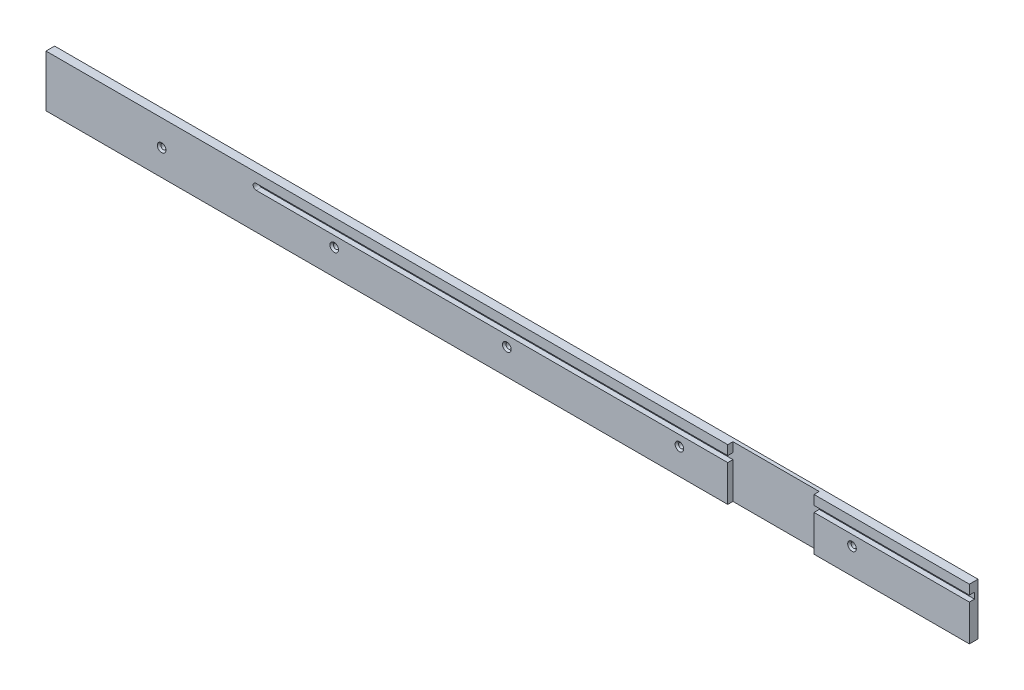
ISO-10303-21;
HEADER;
FILE_DESCRIPTION(('STEP AP214'),'2;1');
FILE_NAME('part.step','',(''),(''),'','','');
FILE_SCHEMA(('AUTOMOTIVE_DESIGN { 1 0 10303 214 1 1 1 1 }'));
ENDSEC;
DATA;
#1=APPLICATION_CONTEXT('core data for automotive mechanical design processes');
#2=APPLICATION_PROTOCOL_DEFINITION('international standard','automotive_design',2000,#1);
#3=PRODUCT_CONTEXT('',#1,'mechanical');
#4=PRODUCT('Part','Part','',(#3));
#5=PRODUCT_RELATED_PRODUCT_CATEGORY('part','',(#4));
#6=PRODUCT_DEFINITION_FORMATION('','',#4);
#7=PRODUCT_DEFINITION_CONTEXT('part definition',#1,'design');
#8=PRODUCT_DEFINITION('design','',#6,#7);
#9=PRODUCT_DEFINITION_SHAPE('','',#8);
#10=(LENGTH_UNIT() NAMED_UNIT(*) SI_UNIT(.MILLI.,.METRE.));
#11=(NAMED_UNIT(*) PLANE_ANGLE_UNIT() SI_UNIT($,.RADIAN.));
#12=(NAMED_UNIT(*) SI_UNIT($,.STERADIAN.) SOLID_ANGLE_UNIT());
#13=UNCERTAINTY_MEASURE_WITH_UNIT(LENGTH_MEASURE(1.E-05),#10,'distance_accuracy_value','');
#14=(GEOMETRIC_REPRESENTATION_CONTEXT(3) GLOBAL_UNCERTAINTY_ASSIGNED_CONTEXT((#13)) GLOBAL_UNIT_ASSIGNED_CONTEXT((#10,
#11,#12)) REPRESENTATION_CONTEXT('',''));
#15=CARTESIAN_POINT('',(0.,0.,0.));
#16=DIRECTION('',(0.,0.,1.));
#17=DIRECTION('',(1.,0.,0.));
#18=AXIS2_PLACEMENT_3D('',#15,#16,#17);
#19=CARTESIAN_POINT('',(0.,0.,5.));
#20=DIRECTION('',(0.,0.,-1.));
#21=DIRECTION('',(-1.,0.,0.));
#22=AXIS2_PLACEMENT_3D('',#19,#20,#21);
#23=PLANE('',#22);
#24=DIRECTION('',(-1.,0.,0.));
#25=VECTOR('',#24,1.);
#26=CARTESIAN_POINT('',(-535.,29.9999999999997,5.));
#27=LINE('',#26,#25);
#28=CARTESIAN_POINT('',(535.,29.9999999999999,5.));
#29=VERTEX_POINT('',#28);
#30=CARTESIAN_POINT('',(355.,29.9999999999999,5.));
#31=VERTEX_POINT('',#30);
#32=EDGE_CURVE('E309',#29,#31,#27,.T.);
#33=ORIENTED_EDGE('',*,*,#32,.T.);
#34=DIRECTION('',(0.,1.,0.));
#35=VECTOR('',#34,1.);
#36=CARTESIAN_POINT('',(355.,29.9999999999999,5.));
#37=LINE('',#36,#35);
#38=CARTESIAN_POINT('',(355.,18.9999999999999,5.));
#39=VERTEX_POINT('',#38);
#40=EDGE_CURVE('E263',#39,#31,#37,.T.);
#41=ORIENTED_EDGE('',*,*,#40,.F.);
#42=DIRECTION('',(-1.,0.,0.));
#43=VECTOR('',#42,1.);
#44=CARTESIAN_POINT('',(355.,18.9999999999999,5.));
#45=LINE('',#44,#43);
#46=CARTESIAN_POINT('',(535.,18.9999999999999,5.));
#47=VERTEX_POINT('',#46);
#48=EDGE_CURVE('E259',#47,#39,#45,.T.);
#49=ORIENTED_EDGE('',*,*,#48,.F.);
#50=DIRECTION('',(0.,1.,0.));
#51=VECTOR('',#50,1.);
#52=CARTESIAN_POINT('',(535.,-29.9999999999999,5.));
#53=LINE('',#52,#51);
#54=EDGE_CURVE('E102',#47,#29,#53,.T.);
#55=ORIENTED_EDGE('',*,*,#54,.T.);
#56=EDGE_LOOP('',(#33,#41,#49,#55));
#57=FACE_BOUND('',#56,.T.);
#58=ADVANCED_FACE('F46',(#57),#23,.F.);
#59=CARTESIAN_POINT('',(399.,0.,5.));
#60=DIRECTION('',(0.,0.,-1.));
#61=DIRECTION('',(-1.,0.,0.));
#62=AXIS2_PLACEMENT_3D('',#59,#60,#61);
#63=CIRCLE('',#62,5.);
#64=CARTESIAN_POINT('',(394.,0.,5.));
#65=VERTEX_POINT('',#64);
#66=EDGE_CURVE('E348',#65,#65,#63,.T.);
#67=ORIENTED_EDGE('',*,*,#66,.T.);
#68=EDGE_LOOP('',(#67));
#69=FACE_BOUND('',#68,.T.);
#70=CARTESIAN_POINT('',(535.,-29.9999999999999,5.));
#71=VERTEX_POINT('',#70);
#72=CARTESIAN_POINT('',(535.,11.9999999999999,5.));
#73=VERTEX_POINT('',#72);
#74=EDGE_CURVE('E305',#71,#73,#53,.T.);
#75=ORIENTED_EDGE('',*,*,#74,.T.);
#76=DIRECTION('',(1.,0.,0.));
#77=VECTOR('',#76,1.);
#78=CARTESIAN_POINT('',(355.,11.9999999999999,5.));
#79=LINE('',#78,#77);
#80=CARTESIAN_POINT('',(355.,11.9999999999999,5.));
#81=VERTEX_POINT('',#80);
#82=EDGE_CURVE('E256',#81,#73,#79,.T.);
#83=ORIENTED_EDGE('',*,*,#82,.F.);
#84=DIRECTION('',(0.,1.,0.));
#85=VECTOR('',#84,1.);
#86=CARTESIAN_POINT('',(355.,11.9999999999999,5.));
#87=LINE('',#86,#85);
#88=CARTESIAN_POINT('',(355.,-30.,5.));
#89=VERTEX_POINT('',#88);
#90=EDGE_CURVE('E252',#89,#81,#87,.T.);
#91=ORIENTED_EDGE('',*,*,#90,.F.);
#92=DIRECTION('',(1.,0.,0.));
#93=VECTOR('',#92,1.);
#94=CARTESIAN_POINT('',(-535.,-30.,5.));
#95=LINE('',#94,#93);
#96=EDGE_CURVE('E72',#89,#71,#95,.T.);
#97=ORIENTED_EDGE('',*,*,#96,.T.);
#98=EDGE_LOOP('',(#75,#83,#91,#97));
#99=FACE_BOUND('',#98,.T.);
#100=ADVANCED_FACE('F393',(#69,#99),#23,.F.);
#101=CARTESIAN_POINT('',(535.,-29.9999999999999,5.));
#102=DIRECTION('',(-1.,0.,0.));
#103=DIRECTION('',(0.,0.,1.));
#104=AXIS2_PLACEMENT_3D('',#101,#102,#103);
#105=PLANE('',#104);
#106=ORIENTED_EDGE('',*,*,#54,.F.);
#107=DIRECTION('',(0.,0.,1.));
#108=VECTOR('',#107,1.);
#109=CARTESIAN_POINT('',(535.,18.9999999999999,-1.));
#110=LINE('',#109,#108);
#111=CARTESIAN_POINT('',(535.,18.9999999999999,-1.));
#112=VERTEX_POINT('',#111);
#113=EDGE_CURVE('E286',#112,#47,#110,.T.);
#114=ORIENTED_EDGE('',*,*,#113,.F.);
#115=DIRECTION('',(0.,1.,0.));
#116=VECTOR('',#115,1.);
#117=CARTESIAN_POINT('',(535.,18.9999999999999,-1.));
#118=LINE('',#117,#116);
#119=CARTESIAN_POINT('',(535.,11.9999999999999,-1.));
#120=VERTEX_POINT('',#119);
#121=EDGE_CURVE('E223',#120,#112,#118,.T.);
#122=ORIENTED_EDGE('',*,*,#121,.F.);
#123=DIRECTION('',(0.,0.,1.));
#124=VECTOR('',#123,1.);
#125=CARTESIAN_POINT('',(535.,11.9999999999999,-1.));
#126=LINE('',#125,#124);
#127=EDGE_CURVE('E289',#120,#73,#126,.T.);
#128=ORIENTED_EDGE('',*,*,#127,.T.);
#129=ORIENTED_EDGE('',*,*,#74,.F.);
#130=DIRECTION('',(0.,0.,-1.));
#131=VECTOR('',#130,1.);
#132=CARTESIAN_POINT('',(535.,-29.9999999999999,5.));
#133=LINE('',#132,#131);
#134=CARTESIAN_POINT('',(535.,-29.9999999999999,-5.));
#135=VERTEX_POINT('',#134);
#136=EDGE_CURVE('E319',#71,#135,#133,.T.);
#137=ORIENTED_EDGE('',*,*,#136,.T.);
#138=DIRECTION('',(0.,1.,0.));
#139=VECTOR('',#138,1.);
#140=CARTESIAN_POINT('',(535.,-29.9999999999999,-5.));
#141=LINE('',#140,#139);
#142=CARTESIAN_POINT('',(535.,29.9999999999999,-5.));
#143=VERTEX_POINT('',#142);
#144=EDGE_CURVE('E272',#135,#143,#141,.T.);
#145=ORIENTED_EDGE('',*,*,#144,.T.);
#146=DIRECTION('',(0.,0.,-1.));
#147=VECTOR('',#146,1.);
#148=CARTESIAN_POINT('',(535.,29.9999999999999,5.));
#149=LINE('',#148,#147);
#150=EDGE_CURVE('E340',#29,#143,#149,.T.);
#151=ORIENTED_EDGE('',*,*,#150,.F.);
#152=EDGE_LOOP('',(#106,#114,#122,#128,#129,#137,#145,#151));
#153=FACE_BOUND('',#152,.T.);
#154=ADVANCED_FACE('F399',(#153),#105,.F.);
#155=CARTESIAN_POINT('',(-535.,29.9999999999997,5.));
#156=DIRECTION('',(0.,-1.,0.));
#157=DIRECTION('',(1.,0.,0.));
#158=AXIS2_PLACEMENT_3D('',#155,#156,#157);
#159=PLANE('',#158);
#160=CARTESIAN_POINT('',(255.,29.9999999999999,5.));
#161=VERTEX_POINT('',#160);
#162=CARTESIAN_POINT('',(-535.,29.9999999999997,5.));
#163=VERTEX_POINT('',#162);
#164=EDGE_CURVE('E308',#161,#163,#27,.T.);
#165=ORIENTED_EDGE('',*,*,#164,.F.);
#166=DIRECTION('',(0.,0.,1.));
#167=VECTOR('',#166,1.);
#168=CARTESIAN_POINT('',(255.,29.9999999999999,-1.));
#169=LINE('',#168,#167);
#170=CARTESIAN_POINT('',(255.,29.9999999999999,-1.));
#171=VERTEX_POINT('',#170);
#172=EDGE_CURVE('E276',#171,#161,#169,.T.);
#173=ORIENTED_EDGE('',*,*,#172,.F.);
#174=DIRECTION('',(-1.,0.,0.));
#175=VECTOR('',#174,1.);
#176=CARTESIAN_POINT('',(255.,29.9999999999999,-1.));
#177=LINE('',#176,#175);
#178=CARTESIAN_POINT('',(355.,29.9999999999999,-1.));
#179=VERTEX_POINT('',#178);
#180=EDGE_CURVE('E235',#179,#171,#177,.T.);
#181=ORIENTED_EDGE('',*,*,#180,.F.);
#182=DIRECTION('',(0.,0.,1.));
#183=VECTOR('',#182,1.);
#184=CARTESIAN_POINT('',(355.,29.9999999999999,-1.));
#185=LINE('',#184,#183);
#186=EDGE_CURVE('E279',#179,#31,#185,.T.);
#187=ORIENTED_EDGE('',*,*,#186,.T.);
#188=ORIENTED_EDGE('',*,*,#32,.F.);
#189=ORIENTED_EDGE('',*,*,#150,.T.);
#190=DIRECTION('',(-1.,0.,0.));
#191=VECTOR('',#190,1.);
#192=CARTESIAN_POINT('',(-535.,29.9999999999997,-5.));
#193=LINE('',#192,#191);
#194=CARTESIAN_POINT('',(-535.,29.9999999999997,-5.));
#195=VERTEX_POINT('',#194);
#196=EDGE_CURVE('E323',#143,#195,#193,.T.);
#197=ORIENTED_EDGE('',*,*,#196,.T.);
#198=DIRECTION('',(0.,0.,-1.));
#199=VECTOR('',#198,1.);
#200=CARTESIAN_POINT('',(-535.,29.9999999999997,5.));
#201=LINE('',#200,#199);
#202=EDGE_CURVE('E336',#163,#195,#201,.T.);
#203=ORIENTED_EDGE('',*,*,#202,.F.);
#204=EDGE_LOOP('',(#165,#173,#181,#187,#188,#189,#197,#203));
#205=FACE_BOUND('',#204,.T.);
#206=ADVANCED_FACE('F431',(#205),#159,.F.);
#207=CARTESIAN_POINT('',(-535.,-30.,5.));
#208=DIRECTION('',(1.,0.,0.));
#209=DIRECTION('',(0.,0.,-1.));
#210=AXIS2_PLACEMENT_3D('',#207,#208,#209);
#211=PLANE('',#210);
#212=DIRECTION('',(0.,-1.,0.));
#213=VECTOR('',#212,1.);
#214=CARTESIAN_POINT('',(-535.,-30.,-5.));
#215=LINE('',#214,#213);
#216=CARTESIAN_POINT('',(-535.,-30.,-5.));
#217=VERTEX_POINT('',#216);
#218=EDGE_CURVE('E326',#195,#217,#215,.T.);
#219=ORIENTED_EDGE('',*,*,#218,.T.);
#220=DIRECTION('',(0.,0.,-1.));
#221=VECTOR('',#220,1.);
#222=CARTESIAN_POINT('',(-535.,-30.,5.));
#223=LINE('',#222,#221);
#224=CARTESIAN_POINT('',(-535.,-30.,5.));
#225=VERTEX_POINT('',#224);
#226=EDGE_CURVE('E333',#225,#217,#223,.T.);
#227=ORIENTED_EDGE('',*,*,#226,.F.);
#228=DIRECTION('',(0.,-1.,0.));
#229=VECTOR('',#228,1.);
#230=CARTESIAN_POINT('',(-535.,-30.,5.));
#231=LINE('',#230,#229);
#232=EDGE_CURVE('E312',#163,#225,#231,.T.);
#233=ORIENTED_EDGE('',*,*,#232,.F.);
#234=ORIENTED_EDGE('',*,*,#202,.T.);
#235=EDGE_LOOP('',(#219,#227,#233,#234));
#236=FACE_BOUND('',#235,.T.);
#237=ADVANCED_FACE('F412',(#236),#211,.F.);
#238=CARTESIAN_POINT('',(-535.,-30.,5.));
#239=DIRECTION('',(0.,1.,0.));
#240=DIRECTION('',(-1.,0.,0.));
#241=AXIS2_PLACEMENT_3D('',#238,#239,#240);
#242=PLANE('',#241);
#243=ORIENTED_EDGE('',*,*,#96,.F.);
#244=DIRECTION('',(0.,0.,1.));
#245=VECTOR('',#244,1.);
#246=CARTESIAN_POINT('',(355.,-30.,-1.));
#247=LINE('',#246,#245);
#248=CARTESIAN_POINT('',(355.,-30.,-1.));
#249=VERTEX_POINT('',#248);
#250=EDGE_CURVE('E296',#249,#89,#247,.T.);
#251=ORIENTED_EDGE('',*,*,#250,.F.);
#252=DIRECTION('',(1.,0.,0.));
#253=VECTOR('',#252,1.);
#254=CARTESIAN_POINT('',(255.,-30.,-1.));
#255=LINE('',#254,#253);
#256=CARTESIAN_POINT('',(255.,-30.,-1.));
#257=VERTEX_POINT('',#256);
#258=EDGE_CURVE('E211',#257,#249,#255,.T.);
#259=ORIENTED_EDGE('',*,*,#258,.F.);
#260=DIRECTION('',(0.,0.,1.));
#261=VECTOR('',#260,1.);
#262=CARTESIAN_POINT('',(255.,-30.,-1.));
#263=LINE('',#262,#261);
#264=CARTESIAN_POINT('',(255.,-30.,5.));
#265=VERTEX_POINT('',#264);
#266=EDGE_CURVE('E299',#257,#265,#263,.T.);
#267=ORIENTED_EDGE('',*,*,#266,.T.);
#268=EDGE_CURVE('E315',#225,#265,#95,.T.);
#269=ORIENTED_EDGE('',*,*,#268,.F.);
#270=ORIENTED_EDGE('',*,*,#226,.T.);
#271=DIRECTION('',(1.,0.,0.));
#272=VECTOR('',#271,1.);
#273=CARTESIAN_POINT('',(-535.,-30.,-5.));
#274=LINE('',#273,#272);
#275=EDGE_CURVE('E94',#217,#135,#274,.T.);
#276=ORIENTED_EDGE('',*,*,#275,.T.);
#277=ORIENTED_EDGE('',*,*,#136,.F.);
#278=EDGE_LOOP('',(#243,#251,#259,#267,#269,#270,#276,#277));
#279=FACE_BOUND('',#278,.T.);
#280=ADVANCED_FACE('F405',(#279),#242,.F.);
#281=CARTESIAN_POINT('',(-401.,0.,5.));
#282=DIRECTION('',(0.,0.,-1.));
#283=DIRECTION('',(-1.,0.,0.));
#284=AXIS2_PLACEMENT_3D('',#281,#282,#283);
#285=CIRCLE('',#284,5.);
#286=CARTESIAN_POINT('',(-406.,0.,5.));
#287=VERTEX_POINT('',#286);
#288=EDGE_CURVE('E11',#287,#287,#285,.T.);
#289=ORIENTED_EDGE('',*,*,#288,.T.);
#290=EDGE_LOOP('',(#289));
#291=FACE_BOUND('',#290,.T.);
#292=CARTESIAN_POINT('',(-201.,0.,5.));
#293=DIRECTION('',(0.,0.,-1.));
#294=DIRECTION('',(-1.,0.,0.));
#295=AXIS2_PLACEMENT_3D('',#292,#293,#294);
#296=CIRCLE('',#295,5.);
#297=CARTESIAN_POINT('',(-206.,0.,5.));
#298=VERTEX_POINT('',#297);
#299=EDGE_CURVE('E372',#298,#298,#296,.T.);
#300=ORIENTED_EDGE('',*,*,#299,.T.);
#301=EDGE_LOOP('',(#300));
#302=FACE_BOUND('',#301,.T.);
#303=CARTESIAN_POINT('',(-1.,0.,5.));
#304=DIRECTION('',(0.,0.,-1.));
#305=DIRECTION('',(-1.,0.,0.));
#306=AXIS2_PLACEMENT_3D('',#303,#304,#305);
#307=CIRCLE('',#306,5.);
#308=CARTESIAN_POINT('',(-6.00000000000001,0.,5.));
#309=VERTEX_POINT('',#308);
#310=EDGE_CURVE('E364',#309,#309,#307,.T.);
#311=ORIENTED_EDGE('',*,*,#310,.T.);
#312=EDGE_LOOP('',(#311));
#313=FACE_BOUND('',#312,.T.);
#314=CARTESIAN_POINT('',(199.,0.,5.));
#315=DIRECTION('',(0.,0.,-1.));
#316=DIRECTION('',(-1.,0.,0.));
#317=AXIS2_PLACEMENT_3D('',#314,#315,#316);
#318=CIRCLE('',#317,5.);
#319=CARTESIAN_POINT('',(194.,0.,5.));
#320=VERTEX_POINT('',#319);
#321=EDGE_CURVE('E356',#320,#320,#318,.T.);
#322=ORIENTED_EDGE('',*,*,#321,.T.);
#323=EDGE_LOOP('',(#322));
#324=FACE_BOUND('',#323,.T.);
#325=DIRECTION('',(-1.,0.,0.));
#326=VECTOR('',#325,1.);
#327=CARTESIAN_POINT('',(-291.5,18.9999999999999,5.));
#328=LINE('',#327,#326);
#329=CARTESIAN_POINT('',(255.,18.9999999999999,5.));
#330=VERTEX_POINT('',#329);
#331=CARTESIAN_POINT('',(-291.5,18.9999999999999,5.));
#332=VERTEX_POINT('',#331);
#333=EDGE_CURVE('E198',#330,#332,#328,.T.);
#334=ORIENTED_EDGE('',*,*,#333,.F.);
#335=DIRECTION('',(0.,-1.,0.));
#336=VECTOR('',#335,1.);
#337=CARTESIAN_POINT('',(255.,29.9999999999999,5.));
#338=LINE('',#337,#336);
#339=EDGE_CURVE('E203',#161,#330,#338,.T.);
#340=ORIENTED_EDGE('',*,*,#339,.F.);
#341=ORIENTED_EDGE('',*,*,#164,.T.);
#342=ORIENTED_EDGE('',*,*,#232,.T.);
#343=ORIENTED_EDGE('',*,*,#268,.T.);
#344=DIRECTION('',(0.,-1.,0.));
#345=VECTOR('',#344,1.);
#346=CARTESIAN_POINT('',(255.,11.9999999999999,5.));
#347=LINE('',#346,#345);
#348=CARTESIAN_POINT('',(255.,11.9999999999999,5.));
#349=VERTEX_POINT('',#348);
#350=EDGE_CURVE('E249',#349,#265,#347,.T.);
#351=ORIENTED_EDGE('',*,*,#350,.F.);
#352=DIRECTION('',(1.,0.,0.));
#353=VECTOR('',#352,1.);
#354=CARTESIAN_POINT('',(-291.5,11.9999999999999,5.));
#355=LINE('',#354,#353);
#356=CARTESIAN_POINT('',(-291.5,11.9999999999999,5.));
#357=VERTEX_POINT('',#356);
#358=EDGE_CURVE('E246',#357,#349,#355,.T.);
#359=ORIENTED_EDGE('',*,*,#358,.F.);
#360=CARTESIAN_POINT('',(-291.5,15.4999999999999,5.));
#361=DIRECTION('',(0.,0.,1.));
#362=DIRECTION('',(-1.,0.,0.));
#363=AXIS2_PLACEMENT_3D('',#360,#361,#362);
#364=CIRCLE('',#363,3.5);
#365=EDGE_CURVE('E63',#332,#357,#364,.T.);
#366=ORIENTED_EDGE('',*,*,#365,.F.);
#367=EDGE_LOOP('',(#334,#340,#341,#342,#343,#351,#359,#366));
#368=FACE_BOUND('',#367,.T.);
#369=ADVANCED_FACE('F395',(#291,#302,#313,#324,#368),#23,.F.);
#370=CARTESIAN_POINT('',(0.,0.,-5.));
#371=DIRECTION('',(0.,0.,-1.));
#372=DIRECTION('',(-1.,0.,0.));
#373=AXIS2_PLACEMENT_3D('',#370,#371,#372);
#374=PLANE('',#373);
#375=CARTESIAN_POINT('',(199.,0.,-5.));
#376=DIRECTION('',(0.,0.,1.));
#377=DIRECTION('',(1.,0.,0.));
#378=AXIS2_PLACEMENT_3D('',#375,#376,#377);
#379=CIRCLE('',#378,2.99999999999999);
#380=CARTESIAN_POINT('',(202.,0.,-5.));
#381=VERTEX_POINT('',#380);
#382=EDGE_CURVE('E565',#381,#381,#379,.T.);
#383=ORIENTED_EDGE('',*,*,#382,.T.);
#384=EDGE_LOOP('',(#383));
#385=FACE_BOUND('',#384,.T.);
#386=CARTESIAN_POINT('',(-1.,0.,-5.));
#387=DIRECTION('',(0.,0.,1.));
#388=DIRECTION('',(1.,0.,0.));
#389=AXIS2_PLACEMENT_3D('',#386,#387,#388);
#390=CIRCLE('',#389,2.99999999999999);
#391=CARTESIAN_POINT('',(1.99999999999999,0.,-5.));
#392=VERTEX_POINT('',#391);
#393=EDGE_CURVE('E567',#392,#392,#390,.T.);
#394=ORIENTED_EDGE('',*,*,#393,.T.);
#395=EDGE_LOOP('',(#394));
#396=FACE_BOUND('',#395,.T.);
#397=CARTESIAN_POINT('',(-201.,0.,-5.));
#398=DIRECTION('',(0.,0.,1.));
#399=DIRECTION('',(1.,0.,0.));
#400=AXIS2_PLACEMENT_3D('',#397,#398,#399);
#401=CIRCLE('',#400,2.99999999999999);
#402=CARTESIAN_POINT('',(-198.,0.,-5.));
#403=VERTEX_POINT('',#402);
#404=EDGE_CURVE('E574',#403,#403,#401,.T.);
#405=ORIENTED_EDGE('',*,*,#404,.T.);
#406=EDGE_LOOP('',(#405));
#407=FACE_BOUND('',#406,.T.);
#408=CARTESIAN_POINT('',(-401.,0.,-5.));
#409=DIRECTION('',(0.,0.,1.));
#410=DIRECTION('',(1.,0.,0.));
#411=AXIS2_PLACEMENT_3D('',#408,#409,#410);
#412=CIRCLE('',#411,2.99999999999999);
#413=CARTESIAN_POINT('',(-398.,0.,-5.));
#414=VERTEX_POINT('',#413);
#415=EDGE_CURVE('E579',#414,#414,#412,.T.);
#416=ORIENTED_EDGE('',*,*,#415,.T.);
#417=EDGE_LOOP('',(#416));
#418=FACE_BOUND('',#417,.T.);
#419=CARTESIAN_POINT('',(399.,0.,-5.));
#420=DIRECTION('',(0.,0.,1.));
#421=DIRECTION('',(1.,0.,0.));
#422=AXIS2_PLACEMENT_3D('',#419,#420,#421);
#423=CIRCLE('',#422,2.99999999999999);
#424=CARTESIAN_POINT('',(402.,0.,-5.));
#425=VERTEX_POINT('',#424);
#426=EDGE_CURVE('E206',#425,#425,#423,.T.);
#427=ORIENTED_EDGE('',*,*,#426,.T.);
#428=EDGE_LOOP('',(#427));
#429=FACE_BOUND('',#428,.T.);
#430=ORIENTED_EDGE('',*,*,#144,.F.);
#431=ORIENTED_EDGE('',*,*,#275,.F.);
#432=ORIENTED_EDGE('',*,*,#218,.F.);
#433=ORIENTED_EDGE('',*,*,#196,.F.);
#434=EDGE_LOOP('',(#430,#431,#432,#433));
#435=FACE_BOUND('',#434,.T.);
#436=ADVANCED_FACE('F404',(#385,#396,#407,#418,#429,#435),#374,.T.);
#437=CARTESIAN_POINT('',(-291.5,15.4999999999999,-1.));
#438=DIRECTION('',(0.,0.,1.));
#439=DIRECTION('',(1.,0.,0.));
#440=AXIS2_PLACEMENT_3D('',#437,#438,#439);
#441=CYLINDRICAL_SURFACE('',#440,3.5);
#442=ORIENTED_EDGE('',*,*,#365,.T.);
#443=DIRECTION('',(0.,0.,1.));
#444=VECTOR('',#443,1.);
#445=CARTESIAN_POINT('',(-291.5,11.9999999999999,-1.));
#446=LINE('',#445,#444);
#447=CARTESIAN_POINT('',(-291.5,11.9999999999999,-1.));
#448=VERTEX_POINT('',#447);
#449=EDGE_CURVE('E172',#448,#357,#446,.T.);
#450=ORIENTED_EDGE('',*,*,#449,.F.);
#451=CARTESIAN_POINT('',(-291.5,15.4999999999999,-1.));
#452=DIRECTION('',(0.,0.,1.));
#453=DIRECTION('',(-1.,0.,0.));
#454=AXIS2_PLACEMENT_3D('',#451,#452,#453);
#455=CIRCLE('',#454,3.5);
#456=CARTESIAN_POINT('',(-291.5,18.9999999999999,-1.));
#457=VERTEX_POINT('',#456);
#458=EDGE_CURVE('E176',#457,#448,#455,.T.);
#459=ORIENTED_EDGE('',*,*,#458,.F.);
#460=DIRECTION('',(0.,0.,1.));
#461=VECTOR('',#460,1.);
#462=CARTESIAN_POINT('',(-291.5,18.9999999999999,-1.));
#463=LINE('',#462,#461);
#464=EDGE_CURVE('E269',#457,#332,#463,.T.);
#465=ORIENTED_EDGE('',*,*,#464,.T.);
#466=EDGE_LOOP('',(#442,#450,#459,#465));
#467=FACE_BOUND('',#466,.T.);
#468=ADVANCED_FACE('F174',(#467),#441,.F.);
#469=CARTESIAN_POINT('',(-291.5,18.9999999999999,-1.));
#470=DIRECTION('',(0.,1.,0.));
#471=DIRECTION('',(0.,0.,1.));
#472=AXIS2_PLACEMENT_3D('',#469,#470,#471);
#473=PLANE('',#472);
#474=ORIENTED_EDGE('',*,*,#333,.T.);
#475=ORIENTED_EDGE('',*,*,#464,.F.);
#476=DIRECTION('',(-1.,0.,0.));
#477=VECTOR('',#476,1.);
#478=CARTESIAN_POINT('',(-291.5,18.9999999999999,-1.));
#479=LINE('',#478,#477);
#480=CARTESIAN_POINT('',(255.,18.9999999999999,-1.));
#481=VERTEX_POINT('',#480);
#482=EDGE_CURVE('E183',#481,#457,#479,.T.);
#483=ORIENTED_EDGE('',*,*,#482,.F.);
#484=DIRECTION('',(0.,0.,1.));
#485=VECTOR('',#484,1.);
#486=CARTESIAN_POINT('',(255.,18.9999999999999,-1.));
#487=LINE('',#486,#485);
#488=EDGE_CURVE('E273',#481,#330,#487,.T.);
#489=ORIENTED_EDGE('',*,*,#488,.T.);
#490=EDGE_LOOP('',(#474,#475,#483,#489));
#491=FACE_BOUND('',#490,.T.);
#492=ADVANCED_FACE('F425',(#491),#473,.F.);
#493=CARTESIAN_POINT('',(255.,29.9999999999999,-1.));
#494=DIRECTION('',(-1.,0.,0.));
#495=DIRECTION('',(0.,0.,1.));
#496=AXIS2_PLACEMENT_3D('',#493,#494,#495);
#497=PLANE('',#496);
#498=ORIENTED_EDGE('',*,*,#339,.T.);
#499=ORIENTED_EDGE('',*,*,#488,.F.);
#500=DIRECTION('',(0.,-1.,0.));
#501=VECTOR('',#500,1.);
#502=CARTESIAN_POINT('',(255.,29.9999999999999,-1.));
#503=LINE('',#502,#501);
#504=EDGE_CURVE('E239',#171,#481,#503,.T.);
#505=ORIENTED_EDGE('',*,*,#504,.F.);
#506=ORIENTED_EDGE('',*,*,#172,.T.);
#507=EDGE_LOOP('',(#498,#499,#505,#506));
#508=FACE_BOUND('',#507,.T.);
#509=ADVANCED_FACE('F427',(#508),#497,.F.);
#510=CARTESIAN_POINT('',(355.,29.9999999999999,-1.));
#511=DIRECTION('',(1.,0.,0.));
#512=DIRECTION('',(0.,0.,-1.));
#513=AXIS2_PLACEMENT_3D('',#510,#511,#512);
#514=PLANE('',#513);
#515=ORIENTED_EDGE('',*,*,#40,.T.);
#516=ORIENTED_EDGE('',*,*,#186,.F.);
#517=DIRECTION('',(0.,1.,0.));
#518=VECTOR('',#517,1.);
#519=CARTESIAN_POINT('',(355.,29.9999999999999,-1.));
#520=LINE('',#519,#518);
#521=CARTESIAN_POINT('',(355.,18.9999999999999,-1.));
#522=VERTEX_POINT('',#521);
#523=EDGE_CURVE('E231',#522,#179,#520,.T.);
#524=ORIENTED_EDGE('',*,*,#523,.F.);
#525=DIRECTION('',(0.,0.,1.));
#526=VECTOR('',#525,1.);
#527=CARTESIAN_POINT('',(355.,18.9999999999999,-1.));
#528=LINE('',#527,#526);
#529=EDGE_CURVE('E283',#522,#39,#528,.T.);
#530=ORIENTED_EDGE('',*,*,#529,.T.);
#531=EDGE_LOOP('',(#515,#516,#524,#530));
#532=FACE_BOUND('',#531,.T.);
#533=ADVANCED_FACE('F507',(#532),#514,.F.);
#534=CARTESIAN_POINT('',(355.,18.9999999999999,-1.));
#535=DIRECTION('',(0.,1.,0.));
#536=DIRECTION('',(0.,0.,1.));
#537=AXIS2_PLACEMENT_3D('',#534,#535,#536);
#538=PLANE('',#537);
#539=ORIENTED_EDGE('',*,*,#48,.T.);
#540=ORIENTED_EDGE('',*,*,#529,.F.);
#541=DIRECTION('',(-1.,0.,0.));
#542=VECTOR('',#541,1.);
#543=CARTESIAN_POINT('',(355.,18.9999999999999,-1.));
#544=LINE('',#543,#542);
#545=EDGE_CURVE('E227',#112,#522,#544,.T.);
#546=ORIENTED_EDGE('',*,*,#545,.F.);
#547=ORIENTED_EDGE('',*,*,#113,.T.);
#548=EDGE_LOOP('',(#539,#540,#546,#547));
#549=FACE_BOUND('',#548,.T.);
#550=ADVANCED_FACE('F504',(#549),#538,.F.);
#551=CARTESIAN_POINT('',(355.,11.9999999999999,-1.));
#552=DIRECTION('',(0.,-1.,0.));
#553=DIRECTION('',(0.,0.,-1.));
#554=AXIS2_PLACEMENT_3D('',#551,#552,#553);
#555=PLANE('',#554);
#556=ORIENTED_EDGE('',*,*,#82,.T.);
#557=ORIENTED_EDGE('',*,*,#127,.F.);
#558=DIRECTION('',(1.,0.,0.));
#559=VECTOR('',#558,1.);
#560=CARTESIAN_POINT('',(355.,11.9999999999999,-1.));
#561=LINE('',#560,#559);
#562=CARTESIAN_POINT('',(355.,11.9999999999999,-1.));
#563=VERTEX_POINT('',#562);
#564=EDGE_CURVE('E219',#563,#120,#561,.T.);
#565=ORIENTED_EDGE('',*,*,#564,.F.);
#566=DIRECTION('',(0.,0.,1.));
#567=VECTOR('',#566,1.);
#568=CARTESIAN_POINT('',(355.,11.9999999999999,-1.));
#569=LINE('',#568,#567);
#570=EDGE_CURVE('E293',#563,#81,#569,.T.);
#571=ORIENTED_EDGE('',*,*,#570,.T.);
#572=EDGE_LOOP('',(#556,#557,#565,#571));
#573=FACE_BOUND('',#572,.T.);
#574=ADVANCED_FACE('F497',(#573),#555,.F.);
#575=CARTESIAN_POINT('',(355.,11.9999999999999,-1.));
#576=DIRECTION('',(1.,0.,0.));
#577=DIRECTION('',(0.,1.,0.));
#578=AXIS2_PLACEMENT_3D('',#575,#576,#577);
#579=PLANE('',#578);
#580=ORIENTED_EDGE('',*,*,#90,.T.);
#581=ORIENTED_EDGE('',*,*,#570,.F.);
#582=DIRECTION('',(0.,1.,0.));
#583=VECTOR('',#582,1.);
#584=CARTESIAN_POINT('',(355.,11.9999999999999,-1.));
#585=LINE('',#584,#583);
#586=EDGE_CURVE('E215',#249,#563,#585,.T.);
#587=ORIENTED_EDGE('',*,*,#586,.F.);
#588=ORIENTED_EDGE('',*,*,#250,.T.);
#589=EDGE_LOOP('',(#580,#581,#587,#588));
#590=FACE_BOUND('',#589,.T.);
#591=ADVANCED_FACE('F493',(#590),#579,.F.);
#592=CARTESIAN_POINT('',(255.,11.9999999999999,-1.));
#593=DIRECTION('',(-1.,0.,0.));
#594=DIRECTION('',(0.,0.,1.));
#595=AXIS2_PLACEMENT_3D('',#592,#593,#594);
#596=PLANE('',#595);
#597=ORIENTED_EDGE('',*,*,#350,.T.);
#598=ORIENTED_EDGE('',*,*,#266,.F.);
#599=DIRECTION('',(0.,-1.,0.));
#600=VECTOR('',#599,1.);
#601=CARTESIAN_POINT('',(255.,11.9999999999999,-1.));
#602=LINE('',#601,#600);
#603=CARTESIAN_POINT('',(255.,11.9999999999999,-1.));
#604=VERTEX_POINT('',#603);
#605=EDGE_CURVE('E192',#604,#257,#602,.T.);
#606=ORIENTED_EDGE('',*,*,#605,.F.);
#607=DIRECTION('',(0.,0.,1.));
#608=VECTOR('',#607,1.);
#609=CARTESIAN_POINT('',(255.,11.9999999999999,-1.));
#610=LINE('',#609,#608);
#611=EDGE_CURVE('E182',#604,#349,#610,.T.);
#612=ORIENTED_EDGE('',*,*,#611,.T.);
#613=EDGE_LOOP('',(#597,#598,#606,#612));
#614=FACE_BOUND('',#613,.T.);
#615=ADVANCED_FACE('F491',(#614),#596,.F.);
#616=CARTESIAN_POINT('',(-291.5,11.9999999999999,-1.));
#617=DIRECTION('',(0.,-1.,0.));
#618=DIRECTION('',(0.,0.,-1.));
#619=AXIS2_PLACEMENT_3D('',#616,#617,#618);
#620=PLANE('',#619);
#621=ORIENTED_EDGE('',*,*,#358,.T.);
#622=ORIENTED_EDGE('',*,*,#611,.F.);
#623=DIRECTION('',(1.,0.,0.));
#624=VECTOR('',#623,1.);
#625=CARTESIAN_POINT('',(-291.5,11.9999999999999,-1.));
#626=LINE('',#625,#624);
#627=EDGE_CURVE('E186',#448,#604,#626,.T.);
#628=ORIENTED_EDGE('',*,*,#627,.F.);
#629=ORIENTED_EDGE('',*,*,#449,.T.);
#630=EDGE_LOOP('',(#621,#622,#628,#629));
#631=FACE_BOUND('',#630,.T.);
#632=ADVANCED_FACE('F187',(#631),#620,.F.);
#633=CARTESIAN_POINT('',(-291.5,15.4999999999999,-1.));
#634=DIRECTION('',(0.,0.,-1.));
#635=DIRECTION('',(-1.,0.,0.));
#636=AXIS2_PLACEMENT_3D('',#633,#634,#635);
#637=PLANE('',#636);
#638=ORIENTED_EDGE('',*,*,#458,.T.);
#639=ORIENTED_EDGE('',*,*,#627,.T.);
#640=ORIENTED_EDGE('',*,*,#605,.T.);
#641=ORIENTED_EDGE('',*,*,#258,.T.);
#642=ORIENTED_EDGE('',*,*,#586,.T.);
#643=ORIENTED_EDGE('',*,*,#564,.T.);
#644=ORIENTED_EDGE('',*,*,#121,.T.);
#645=ORIENTED_EDGE('',*,*,#545,.T.);
#646=ORIENTED_EDGE('',*,*,#523,.T.);
#647=ORIENTED_EDGE('',*,*,#180,.T.);
#648=ORIENTED_EDGE('',*,*,#504,.T.);
#649=ORIENTED_EDGE('',*,*,#482,.T.);
#650=EDGE_LOOP('',(#638,#639,#640,#641,#642,#643,#644,#645,#646,#647,#648,#649));
#651=FACE_BOUND('',#650,.T.);
#652=ADVANCED_FACE('F194',(#651),#637,.F.);
#653=CARTESIAN_POINT('',(399.,0.,-5.));
#654=DIRECTION('',(0.,0.,1.));
#655=DIRECTION('',(1.,0.,0.));
#656=AXIS2_PLACEMENT_3D('',#653,#654,#655);
#657=CYLINDRICAL_SURFACE('',#656,2.99999999999999);
#658=CARTESIAN_POINT('',(399.,0.,2.99999999999998));
#659=DIRECTION('',(0.,0.,-1.));
#660=DIRECTION('',(-1.,0.,0.));
#661=AXIS2_PLACEMENT_3D('',#658,#659,#660);
#662=CIRCLE('',#661,2.99999999999999);
#663=CARTESIAN_POINT('',(396.,0.,2.99999999999998));
#664=VERTEX_POINT('',#663);
#665=EDGE_CURVE('E344',#664,#664,#662,.F.);
#666=ORIENTED_EDGE('',*,*,#665,.T.);
#667=EDGE_LOOP('',(#666));
#668=FACE_BOUND('',#667,.T.);
#669=ORIENTED_EDGE('',*,*,#426,.F.);
#670=EDGE_LOOP('',(#669));
#671=FACE_BOUND('',#670,.T.);
#672=ADVANCED_FACE('F537',(#668,#671),#657,.F.);
#673=CARTESIAN_POINT('',(399.,0.,2.99999999999998));
#674=DIRECTION('',(0.,0.,1.));
#675=DIRECTION('',(1.,0.,0.));
#676=AXIS2_PLACEMENT_3D('',#673,#674,#675);
#677=CONICAL_SURFACE('',#676,2.99999999999999,0.785398163397446);
#678=ORIENTED_EDGE('',*,*,#66,.F.);
#679=EDGE_LOOP('',(#678));
#680=FACE_BOUND('',#679,.T.);
#681=ORIENTED_EDGE('',*,*,#665,.F.);
#682=EDGE_LOOP('',(#681));
#683=FACE_BOUND('',#682,.T.);
#684=ADVANCED_FACE('F540',(#680,#683),#677,.F.);
#685=CARTESIAN_POINT('',(-401.,0.,-5.));
#686=DIRECTION('',(0.,0.,1.));
#687=DIRECTION('',(1.,0.,0.));
#688=AXIS2_PLACEMENT_3D('',#685,#686,#687);
#689=CYLINDRICAL_SURFACE('',#688,2.99999999999999);
#690=CARTESIAN_POINT('',(-401.,0.,2.99999999999998));
#691=DIRECTION('',(0.,0.,-1.));
#692=DIRECTION('',(-1.,0.,0.));
#693=AXIS2_PLACEMENT_3D('',#690,#691,#692);
#694=CIRCLE('',#693,2.99999999999999);
#695=CARTESIAN_POINT('',(-404.,0.,2.99999999999998));
#696=VERTEX_POINT('',#695);
#697=EDGE_CURVE('E56',#696,#696,#694,.F.);
#698=ORIENTED_EDGE('',*,*,#697,.T.);
#699=EDGE_LOOP('',(#698));
#700=FACE_BOUND('',#699,.T.);
#701=ORIENTED_EDGE('',*,*,#415,.F.);
#702=EDGE_LOOP('',(#701));
#703=FACE_BOUND('',#702,.T.);
#704=ADVANCED_FACE('F380',(#700,#703),#689,.F.);
#705=CARTESIAN_POINT('',(-201.,0.,-5.));
#706=DIRECTION('',(0.,0.,1.));
#707=DIRECTION('',(1.,0.,0.));
#708=AXIS2_PLACEMENT_3D('',#705,#706,#707);
#709=CYLINDRICAL_SURFACE('',#708,2.99999999999999);
#710=CARTESIAN_POINT('',(-201.,0.,2.99999999999998));
#711=DIRECTION('',(0.,0.,-1.));
#712=DIRECTION('',(-1.,0.,0.));
#713=AXIS2_PLACEMENT_3D('',#710,#711,#712);
#714=CIRCLE('',#713,2.99999999999999);
#715=CARTESIAN_POINT('',(-204.,0.,2.99999999999998));
#716=VERTEX_POINT('',#715);
#717=EDGE_CURVE('E368',#716,#716,#714,.F.);
#718=ORIENTED_EDGE('',*,*,#717,.T.);
#719=EDGE_LOOP('',(#718));
#720=FACE_BOUND('',#719,.T.);
#721=ORIENTED_EDGE('',*,*,#404,.F.);
#722=EDGE_LOOP('',(#721));
#723=FACE_BOUND('',#722,.T.);
#724=ADVANCED_FACE('F544',(#720,#723),#709,.F.);
#725=CARTESIAN_POINT('',(-1.,0.,-5.));
#726=DIRECTION('',(0.,0.,1.));
#727=DIRECTION('',(1.,0.,0.));
#728=AXIS2_PLACEMENT_3D('',#725,#726,#727);
#729=CYLINDRICAL_SURFACE('',#728,2.99999999999999);
#730=CARTESIAN_POINT('',(-1.,0.,2.99999999999998));
#731=DIRECTION('',(0.,0.,-1.));
#732=DIRECTION('',(-1.,0.,0.));
#733=AXIS2_PLACEMENT_3D('',#730,#731,#732);
#734=CIRCLE('',#733,2.99999999999999);
#735=CARTESIAN_POINT('',(-4.,0.,2.99999999999998));
#736=VERTEX_POINT('',#735);
#737=EDGE_CURVE('E360',#736,#736,#734,.F.);
#738=ORIENTED_EDGE('',*,*,#737,.T.);
#739=EDGE_LOOP('',(#738));
#740=FACE_BOUND('',#739,.T.);
#741=ORIENTED_EDGE('',*,*,#393,.F.);
#742=EDGE_LOOP('',(#741));
#743=FACE_BOUND('',#742,.T.);
#744=ADVANCED_FACE('F547',(#740,#743),#729,.F.);
#745=CARTESIAN_POINT('',(199.,0.,-5.));
#746=DIRECTION('',(0.,0.,1.));
#747=DIRECTION('',(1.,0.,0.));
#748=AXIS2_PLACEMENT_3D('',#745,#746,#747);
#749=CYLINDRICAL_SURFACE('',#748,2.99999999999999);
#750=CARTESIAN_POINT('',(199.,0.,2.99999999999998));
#751=DIRECTION('',(0.,0.,-1.));
#752=DIRECTION('',(-1.,0.,0.));
#753=AXIS2_PLACEMENT_3D('',#750,#751,#752);
#754=CIRCLE('',#753,2.99999999999999);
#755=CARTESIAN_POINT('',(196.,0.,2.99999999999998));
#756=VERTEX_POINT('',#755);
#757=EDGE_CURVE('E352',#756,#756,#754,.F.);
#758=ORIENTED_EDGE('',*,*,#757,.T.);
#759=EDGE_LOOP('',(#758));
#760=FACE_BOUND('',#759,.T.);
#761=ORIENTED_EDGE('',*,*,#382,.F.);
#762=EDGE_LOOP('',(#761));
#763=FACE_BOUND('',#762,.T.);
#764=ADVANCED_FACE('F551',(#760,#763),#749,.F.);
#765=CARTESIAN_POINT('',(199.,0.,2.99999999999998));
#766=DIRECTION('',(0.,0.,1.));
#767=DIRECTION('',(1.,0.,0.));
#768=AXIS2_PLACEMENT_3D('',#765,#766,#767);
#769=CONICAL_SURFACE('',#768,2.99999999999999,0.785398163397446);
#770=ORIENTED_EDGE('',*,*,#321,.F.);
#771=EDGE_LOOP('',(#770));
#772=FACE_BOUND('',#771,.T.);
#773=ORIENTED_EDGE('',*,*,#757,.F.);
#774=EDGE_LOOP('',(#773));
#775=FACE_BOUND('',#774,.T.);
#776=ADVANCED_FACE('F554',(#772,#775),#769,.F.);
#777=CARTESIAN_POINT('',(-1.,0.,2.99999999999998));
#778=DIRECTION('',(0.,0.,1.));
#779=DIRECTION('',(1.,0.,0.));
#780=AXIS2_PLACEMENT_3D('',#777,#778,#779);
#781=CONICAL_SURFACE('',#780,2.99999999999999,0.785398163397446);
#782=ORIENTED_EDGE('',*,*,#310,.F.);
#783=EDGE_LOOP('',(#782));
#784=FACE_BOUND('',#783,.T.);
#785=ORIENTED_EDGE('',*,*,#737,.F.);
#786=EDGE_LOOP('',(#785));
#787=FACE_BOUND('',#786,.T.);
#788=ADVANCED_FACE('F389',(#784,#787),#781,.F.);
#789=CARTESIAN_POINT('',(-201.,0.,2.99999999999998));
#790=DIRECTION('',(0.,0.,1.));
#791=DIRECTION('',(1.,0.,0.));
#792=AXIS2_PLACEMENT_3D('',#789,#790,#791);
#793=CONICAL_SURFACE('',#792,2.99999999999999,0.785398163397446);
#794=ORIENTED_EDGE('',*,*,#299,.F.);
#795=EDGE_LOOP('',(#794));
#796=FACE_BOUND('',#795,.T.);
#797=ORIENTED_EDGE('',*,*,#717,.F.);
#798=EDGE_LOOP('',(#797));
#799=FACE_BOUND('',#798,.T.);
#800=ADVANCED_FACE('F384',(#796,#799),#793,.F.);
#801=CARTESIAN_POINT('',(-401.,0.,2.99999999999998));
#802=DIRECTION('',(0.,0.,1.));
#803=DIRECTION('',(1.,0.,0.));
#804=AXIS2_PLACEMENT_3D('',#801,#802,#803);
#805=CONICAL_SURFACE('',#804,2.99999999999999,0.785398163397446);
#806=ORIENTED_EDGE('',*,*,#288,.F.);
#807=EDGE_LOOP('',(#806));
#808=FACE_BOUND('',#807,.T.);
#809=ORIENTED_EDGE('',*,*,#697,.F.);
#810=EDGE_LOOP('',(#809));
#811=FACE_BOUND('',#810,.T.);
#812=ADVANCED_FACE('F49',(#808,#811),#805,.F.);
#813=CLOSED_SHELL('',(#58,#100,#154,#206,#237,#280,#369,#436,#468,#492,#509,#533,#550,#574,#591,
#615,#632,#652,#672,#684,#704,#724,#744,#764,#776,#788,#800,#812));
#814=MANIFOLD_SOLID_BREP('B2',#813);
#815=ADVANCED_BREP_SHAPE_REPRESENTATION('',(#18,#814),#14);
#816=SHAPE_DEFINITION_REPRESENTATION(#9,#815);
ENDSEC;
END-ISO-10303-21;
